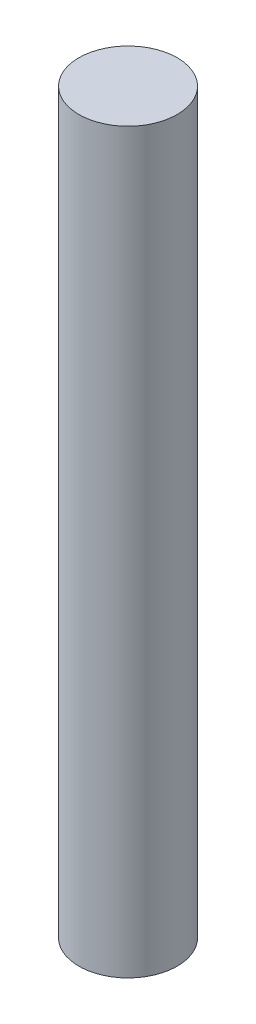
ISO-10303-21;
HEADER;
FILE_DESCRIPTION(('STEP AP214'),'2;1');
FILE_NAME('part.step','',(''),(''),'','','');
FILE_SCHEMA(('AUTOMOTIVE_DESIGN { 1 0 10303 214 1 1 1 1 }'));
ENDSEC;
DATA;
#1=APPLICATION_CONTEXT('core data for automotive mechanical design processes');
#2=APPLICATION_PROTOCOL_DEFINITION('international standard','automotive_design',2000,#1);
#3=PRODUCT_CONTEXT('',#1,'mechanical');
#4=PRODUCT('Part','Part','',(#3));
#5=PRODUCT_RELATED_PRODUCT_CATEGORY('part','',(#4));
#6=PRODUCT_DEFINITION_FORMATION('','',#4);
#7=PRODUCT_DEFINITION_CONTEXT('part definition',#1,'design');
#8=PRODUCT_DEFINITION('design','',#6,#7);
#9=PRODUCT_DEFINITION_SHAPE('','',#8);
#10=(LENGTH_UNIT() NAMED_UNIT(*) SI_UNIT(.MILLI.,.METRE.));
#11=(NAMED_UNIT(*) PLANE_ANGLE_UNIT() SI_UNIT($,.RADIAN.));
#12=(NAMED_UNIT(*) SI_UNIT($,.STERADIAN.) SOLID_ANGLE_UNIT());
#13=UNCERTAINTY_MEASURE_WITH_UNIT(LENGTH_MEASURE(1.E-05),#10,'distance_accuracy_value','');
#14=(GEOMETRIC_REPRESENTATION_CONTEXT(3) GLOBAL_UNCERTAINTY_ASSIGNED_CONTEXT((#13)) GLOBAL_UNIT_ASSIGNED_CONTEXT((#10,
#11,#12)) REPRESENTATION_CONTEXT('',''));
#15=CARTESIAN_POINT('',(0.,0.,0.));
#16=DIRECTION('',(0.,0.,1.));
#17=DIRECTION('',(1.,0.,0.));
#18=AXIS2_PLACEMENT_3D('',#15,#16,#17);
#19=CARTESIAN_POINT('',(0.,76.2,0.));
#20=DIRECTION('',(0.,-1.,0.));
#21=DIRECTION('',(0.,0.,-1.));
#22=AXIS2_PLACEMENT_3D('',#19,#20,#21);
#23=CYLINDRICAL_SURFACE('',#22,5.08);
#24=CARTESIAN_POINT('',(0.,76.2,0.));
#25=DIRECTION('',(0.,1.,0.));
#26=DIRECTION('',(0.,0.,1.));
#27=AXIS2_PLACEMENT_3D('',#24,#25,#26);
#28=CIRCLE('',#27,5.08);
#29=CARTESIAN_POINT('',(0.,76.2,-5.08));
#30=VERTEX_POINT('',#29);
#31=EDGE_CURVE('E10',#30,#30,#28,.T.);
#32=CARTESIAN_POINT('',(0.,0.,0.));
#33=DIRECTION('',(0.,1.,0.));
#34=DIRECTION('',(0.,0.,1.));
#35=AXIS2_PLACEMENT_3D('',#32,#33,#34);
#36=CIRCLE('',#35,5.08);
#37=CARTESIAN_POINT('',(0.,0.,-5.08));
#38=VERTEX_POINT('',#37);
#39=EDGE_CURVE('E48',#38,#38,#36,.T.);
#40=CARTESIAN_POINT('',(0.,76.2,-5.08));
#41=CARTESIAN_POINT('',(0.,75.40625,-5.08));
#42=CARTESIAN_POINT('',(0.,74.6125,-5.08));
#43=CARTESIAN_POINT('',(0.,73.025,-5.08));
#44=CARTESIAN_POINT('',(0.,72.23125,-5.08));
#45=CARTESIAN_POINT('',(0.,70.64375,-5.08));
#46=CARTESIAN_POINT('',(0.,69.85,-5.08));
#47=CARTESIAN_POINT('',(0.,68.2625,-5.08));
#48=CARTESIAN_POINT('',(0.,67.46875,-5.08));
#49=CARTESIAN_POINT('',(0.,65.88125,-5.08));
#50=CARTESIAN_POINT('',(0.,65.0875,-5.08));
#51=CARTESIAN_POINT('',(0.,63.5,-5.08));
#52=CARTESIAN_POINT('',(0.,62.70625,-5.08));
#53=CARTESIAN_POINT('',(0.,61.11875,-5.08));
#54=CARTESIAN_POINT('',(0.,60.325,-5.08));
#55=CARTESIAN_POINT('',(0.,58.7375,-5.08));
#56=CARTESIAN_POINT('',(0.,57.94375,-5.08));
#57=CARTESIAN_POINT('',(0.,56.35625,-5.08));
#58=CARTESIAN_POINT('',(0.,55.5625,-5.08));
#59=CARTESIAN_POINT('',(0.,53.975,-5.08));
#60=CARTESIAN_POINT('',(0.,53.18125,-5.08));
#61=CARTESIAN_POINT('',(0.,51.59375,-5.08));
#62=CARTESIAN_POINT('',(0.,50.8,-5.08));
#63=CARTESIAN_POINT('',(0.,49.2125,-5.08));
#64=CARTESIAN_POINT('',(0.,48.41875,-5.08));
#65=CARTESIAN_POINT('',(0.,46.83125,-5.08));
#66=CARTESIAN_POINT('',(0.,46.0375,-5.08));
#67=CARTESIAN_POINT('',(0.,44.45,-5.08));
#68=CARTESIAN_POINT('',(0.,43.65625,-5.08));
#69=CARTESIAN_POINT('',(0.,42.06875,-5.08));
#70=CARTESIAN_POINT('',(0.,41.275,-5.08));
#71=CARTESIAN_POINT('',(0.,39.6875,-5.08));
#72=CARTESIAN_POINT('',(0.,38.89375,-5.08));
#73=CARTESIAN_POINT('',(0.,37.30625,-5.08));
#74=CARTESIAN_POINT('',(0.,36.5125,-5.08));
#75=CARTESIAN_POINT('',(0.,34.925,-5.08));
#76=CARTESIAN_POINT('',(0.,34.13125,-5.08));
#77=CARTESIAN_POINT('',(0.,32.54375,-5.08));
#78=CARTESIAN_POINT('',(0.,31.75,-5.08));
#79=CARTESIAN_POINT('',(0.,30.1625,-5.08));
#80=CARTESIAN_POINT('',(0.,29.36875,-5.08));
#81=CARTESIAN_POINT('',(0.,27.78125,-5.08));
#82=CARTESIAN_POINT('',(0.,26.9875,-5.08));
#83=CARTESIAN_POINT('',(0.,25.4,-5.08));
#84=CARTESIAN_POINT('',(0.,24.60625,-5.08));
#85=CARTESIAN_POINT('',(0.,23.01875,-5.08));
#86=CARTESIAN_POINT('',(0.,22.225,-5.08));
#87=CARTESIAN_POINT('',(0.,20.6375,-5.08));
#88=CARTESIAN_POINT('',(0.,19.84375,-5.08));
#89=CARTESIAN_POINT('',(0.,18.25625,-5.08));
#90=CARTESIAN_POINT('',(0.,17.4625,-5.08));
#91=CARTESIAN_POINT('',(0.,15.875,-5.08));
#92=CARTESIAN_POINT('',(0.,15.08125,-5.08));
#93=CARTESIAN_POINT('',(0.,13.49375,-5.08));
#94=CARTESIAN_POINT('',(0.,12.7,-5.08));
#95=CARTESIAN_POINT('',(0.,11.1125,-5.08));
#96=CARTESIAN_POINT('',(0.,10.31875,-5.08));
#97=CARTESIAN_POINT('',(0.,8.73125,-5.08));
#98=CARTESIAN_POINT('',(0.,7.93750000000001,-5.08));
#99=CARTESIAN_POINT('',(0.,6.35,-5.08));
#100=CARTESIAN_POINT('',(0.,5.55625,-5.08));
#101=CARTESIAN_POINT('',(0.,3.96875,-5.08));
#102=CARTESIAN_POINT('',(0.,3.175,-5.08));
#103=CARTESIAN_POINT('',(0.,1.5875,-5.08));
#104=CARTESIAN_POINT('',(0.,0.793750000000001,-5.08));
#105=CARTESIAN_POINT('',(0.,0.,-5.08));
#106=B_SPLINE_CURVE_WITH_KNOTS('',3,(#40,#41,#42,#43,#44,#45,#46,#47,#48,#49,#50,#51,#52,#53,
#54,#55,#56,#57,#58,#59,#60,#61,#62,#63,#64,#65,#66,#67,#68,#69,#70,#71,#72,#73,#74,#75,#76,#77,
#78,#79,#80,#81,#82,#83,#84,#85,#86,#87,#88,#89,#90,#91,#92,#93,#94,#95,#96,#97,#98,#99,#100,
#101,#102,#103,#104,#105),.UNSPECIFIED.,.F.,.F.,(4,2,2,2,2,2,2,2,2,2,2,2,2,2,2,2,2,2,2,2,2,2,2,
2,2,2,2,2,2,2,2,2,4),(0.,2.38124999999999,4.76249999999999,7.14374999999999,9.52499999999999,
11.90625,14.2875,16.66875,19.05,21.43125,23.8125,26.19375,28.575,30.95625,33.3375,35.71875,38.1,
40.48125,42.8625,45.24375,47.625,50.00625,52.3875,54.76875,57.15,59.53125,61.9125,64.29375,
66.675,69.05625,71.4375,73.81875,76.2),.UNSPECIFIED.);
#107=EDGE_CURVE('BSEAM45',#30,#38,#106,.T.);
#108=ORIENTED_EDGE('',*,*,#31,.F.);
#109=ORIENTED_EDGE('',*,*,#39,.T.);
#110=ORIENTED_EDGE('',*,*,#107,.T.);
#111=ORIENTED_EDGE('',*,*,#107,.F.);
#112=EDGE_LOOP('',(#108,#110,#109,#111));
#113=FACE_BOUND('',#112,.T.);
#114=ADVANCED_FACE('F45',(#113),#23,.T.);
#115=CARTESIAN_POINT('',(0.,76.2,0.));
#116=DIRECTION('',(0.,1.,0.));
#117=DIRECTION('',(0.,0.,1.));
#118=AXIS2_PLACEMENT_3D('',#115,#116,#117);
#119=PLANE('',#118);
#120=ORIENTED_EDGE('',*,*,#31,.T.);
#121=EDGE_LOOP('',(#120));
#122=FACE_BOUND('',#121,.T.);
#123=ADVANCED_FACE('F62',(#122),#119,.T.);
#124=CARTESIAN_POINT('',(0.,0.,0.));
#125=DIRECTION('',(0.,1.,0.));
#126=DIRECTION('',(0.,0.,1.));
#127=AXIS2_PLACEMENT_3D('',#124,#125,#126);
#128=PLANE('',#127);
#129=ORIENTED_EDGE('',*,*,#39,.F.);
#130=EDGE_LOOP('',(#129));
#131=FACE_BOUND('',#130,.T.);
#132=ADVANCED_FACE('F60',(#131),#128,.F.);
#133=CLOSED_SHELL('',(#114,#123,#132));
#134=MANIFOLD_SOLID_BREP('B2',#133);
#135=ADVANCED_BREP_SHAPE_REPRESENTATION('',(#18,#134),#14);
#136=SHAPE_DEFINITION_REPRESENTATION(#9,#135);
ENDSEC;
END-ISO-10303-21;
